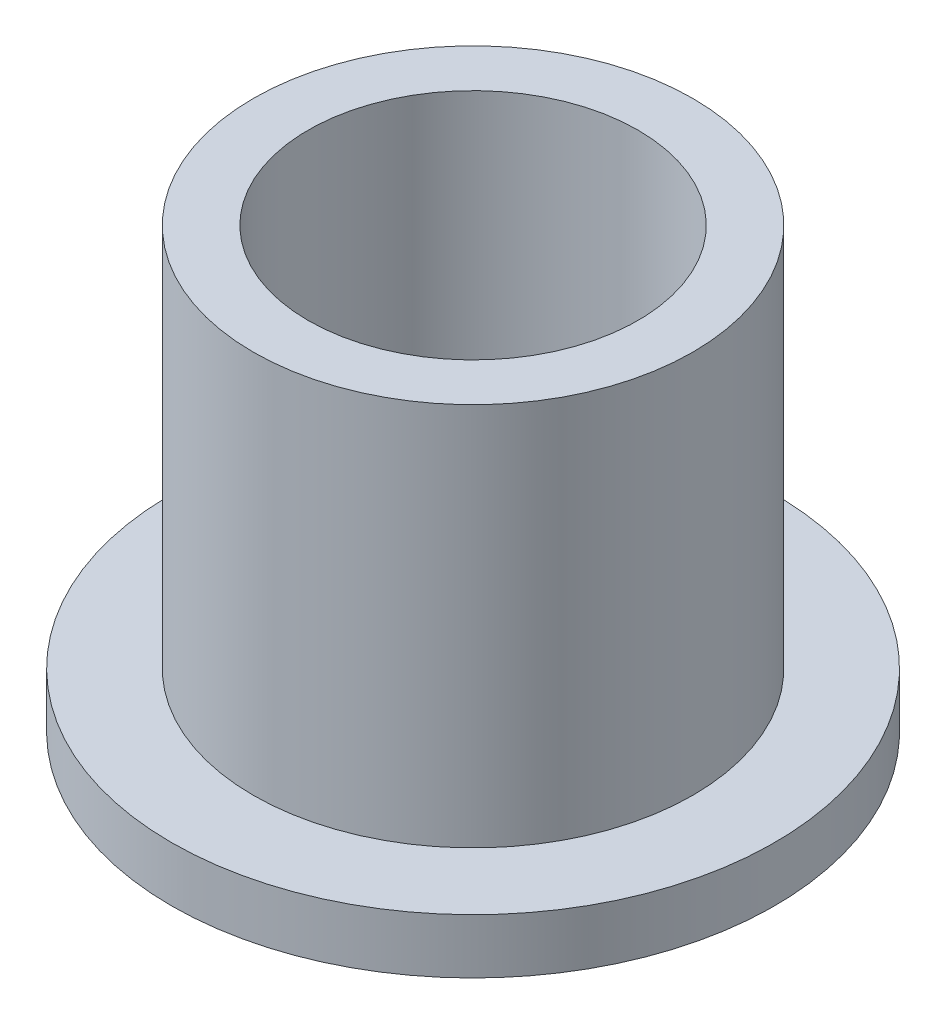
ISO-10303-21;
HEADER;
FILE_DESCRIPTION(('STEP AP214'),'2;1');
FILE_NAME('part.step','',(''),(''),'','','');
FILE_SCHEMA(('AUTOMOTIVE_DESIGN { 1 0 10303 214 1 1 1 1 }'));
ENDSEC;
DATA;
#1=APPLICATION_CONTEXT('core data for automotive mechanical design processes');
#2=APPLICATION_PROTOCOL_DEFINITION('international standard','automotive_design',2000,#1);
#3=PRODUCT_CONTEXT('',#1,'mechanical');
#4=PRODUCT('Part','Part','',(#3));
#5=PRODUCT_RELATED_PRODUCT_CATEGORY('part','',(#4));
#6=PRODUCT_DEFINITION_FORMATION('','',#4);
#7=PRODUCT_DEFINITION_CONTEXT('part definition',#1,'design');
#8=PRODUCT_DEFINITION('design','',#6,#7);
#9=PRODUCT_DEFINITION_SHAPE('','',#8);
#10=(LENGTH_UNIT() NAMED_UNIT(*) SI_UNIT(.MILLI.,.METRE.));
#11=(NAMED_UNIT(*) PLANE_ANGLE_UNIT() SI_UNIT($,.RADIAN.));
#12=(NAMED_UNIT(*) SI_UNIT($,.STERADIAN.) SOLID_ANGLE_UNIT());
#13=UNCERTAINTY_MEASURE_WITH_UNIT(LENGTH_MEASURE(1.E-05),#10,'distance_accuracy_value','');
#14=(GEOMETRIC_REPRESENTATION_CONTEXT(3) GLOBAL_UNCERTAINTY_ASSIGNED_CONTEXT((#13)) GLOBAL_UNIT_ASSIGNED_CONTEXT((#10,
#11,#12)) REPRESENTATION_CONTEXT('',''));
#15=CARTESIAN_POINT('',(0.,0.,0.));
#16=DIRECTION('',(0.,0.,1.));
#17=DIRECTION('',(1.,0.,0.));
#18=AXIS2_PLACEMENT_3D('',#15,#16,#17);
#19=CARTESIAN_POINT('',(0.,12.7,0.));
#20=DIRECTION('',(0.,1.,0.));
#21=DIRECTION('',(0.,0.,1.));
#22=AXIS2_PLACEMENT_3D('',#19,#20,#21);
#23=PLANE('',#22);
#24=CARTESIAN_POINT('',(0.,12.7,0.));
#25=DIRECTION('',(0.,1.,0.));
#26=DIRECTION('',(0.,0.,1.));
#27=AXIS2_PLACEMENT_3D('',#24,#25,#26);
#28=CIRCLE('',#27,6.3627);
#29=CARTESIAN_POINT('',(0.,12.7,6.3627));
#30=VERTEX_POINT('',#29);
#31=EDGE_CURVE('E10',#30,#30,#28,.T.);
#32=ORIENTED_EDGE('',*,*,#31,.T.);
#33=EDGE_LOOP('',(#32));
#34=FACE_BOUND('',#33,.T.);
#35=CARTESIAN_POINT('',(0.,12.7,0.));
#36=DIRECTION('',(0.,1.,0.));
#37=DIRECTION('',(0.,0.,1.));
#38=AXIS2_PLACEMENT_3D('',#35,#36,#37);
#39=CIRCLE('',#38,4.7752);
#40=CARTESIAN_POINT('',(0.,12.7,4.7752));
#41=VERTEX_POINT('',#40);
#42=EDGE_CURVE('E40',#41,#41,#39,.T.);
#43=ORIENTED_EDGE('',*,*,#42,.F.);
#44=EDGE_LOOP('',(#43));
#45=FACE_BOUND('',#44,.T.);
#46=ADVANCED_FACE('F33',(#34,#45),#23,.T.);
#47=CARTESIAN_POINT('',(0.,0.,0.));
#48=DIRECTION('',(0.,1.,0.));
#49=DIRECTION('',(0.,0.,1.));
#50=AXIS2_PLACEMENT_3D('',#47,#48,#49);
#51=PLANE('',#50);
#52=CARTESIAN_POINT('',(0.,0.,0.));
#53=DIRECTION('',(0.,1.,0.));
#54=DIRECTION('',(0.,0.,1.));
#55=AXIS2_PLACEMENT_3D('',#52,#53,#54);
#56=CIRCLE('',#55,4.7752);
#57=CARTESIAN_POINT('',(0.,0.,4.7752));
#58=VERTEX_POINT('',#57);
#59=EDGE_CURVE('E44',#58,#58,#56,.T.);
#60=ORIENTED_EDGE('',*,*,#59,.T.);
#61=EDGE_LOOP('',(#60));
#62=FACE_BOUND('',#61,.T.);
#63=CARTESIAN_POINT('',(0.,0.,0.));
#64=DIRECTION('',(0.,1.,0.));
#65=DIRECTION('',(0.,0.,1.));
#66=AXIS2_PLACEMENT_3D('',#63,#64,#65);
#67=CIRCLE('',#66,8.73125);
#68=CARTESIAN_POINT('',(0.,0.,8.73125));
#69=VERTEX_POINT('',#68);
#70=EDGE_CURVE('E51',#69,#69,#67,.T.);
#71=ORIENTED_EDGE('',*,*,#70,.F.);
#72=EDGE_LOOP('',(#71));
#73=FACE_BOUND('',#72,.T.);
#74=ADVANCED_FACE('F76',(#62,#73),#51,.F.);
#75=CARTESIAN_POINT('',(0.,12.7,0.));
#76=DIRECTION('',(0.,-1.,0.));
#77=DIRECTION('',(0.,0.,-1.));
#78=AXIS2_PLACEMENT_3D('',#75,#76,#77);
#79=CYLINDRICAL_SURFACE('',#78,6.3627);
#80=CARTESIAN_POINT('',(0.,1.5875,0.));
#81=DIRECTION('',(0.,1.,0.));
#82=DIRECTION('',(0.,0.,1.));
#83=AXIS2_PLACEMENT_3D('',#80,#81,#82);
#84=CIRCLE('',#83,6.3627);
#85=CARTESIAN_POINT('',(0.,1.5875,6.3627));
#86=VERTEX_POINT('',#85);
#87=EDGE_CURVE('E54',#86,#86,#84,.T.);
#88=ORIENTED_EDGE('',*,*,#87,.T.);
#89=EDGE_LOOP('',(#88));
#90=FACE_BOUND('',#89,.T.);
#91=ORIENTED_EDGE('',*,*,#31,.F.);
#92=EDGE_LOOP('',(#91));
#93=FACE_BOUND('',#92,.T.);
#94=ADVANCED_FACE('F35',(#90,#93),#79,.T.);
#95=CARTESIAN_POINT('',(0.,12.7,0.));
#96=DIRECTION('',(0.,-1.,0.));
#97=DIRECTION('',(0.,0.,-1.));
#98=AXIS2_PLACEMENT_3D('',#95,#96,#97);
#99=CYLINDRICAL_SURFACE('',#98,4.7752);
#100=ORIENTED_EDGE('',*,*,#42,.T.);
#101=EDGE_LOOP('',(#100));
#102=FACE_BOUND('',#101,.T.);
#103=ORIENTED_EDGE('',*,*,#59,.F.);
#104=EDGE_LOOP('',(#103));
#105=FACE_BOUND('',#104,.T.);
#106=ADVANCED_FACE('F65',(#102,#105),#99,.F.);
#107=CARTESIAN_POINT('',(0.,1.5875,0.));
#108=DIRECTION('',(0.,1.,0.));
#109=DIRECTION('',(0.,0.,1.));
#110=AXIS2_PLACEMENT_3D('',#107,#108,#109);
#111=PLANE('',#110);
#112=CARTESIAN_POINT('',(0.,1.5875,0.));
#113=DIRECTION('',(0.,1.,0.));
#114=DIRECTION('',(0.,0.,1.));
#115=AXIS2_PLACEMENT_3D('',#112,#113,#114);
#116=CIRCLE('',#115,8.73125);
#117=CARTESIAN_POINT('',(0.,1.5875,8.73125));
#118=VERTEX_POINT('',#117);
#119=EDGE_CURVE('E49',#118,#118,#116,.T.);
#120=ORIENTED_EDGE('',*,*,#119,.T.);
#121=EDGE_LOOP('',(#120));
#122=FACE_BOUND('',#121,.T.);
#123=ORIENTED_EDGE('',*,*,#87,.F.);
#124=EDGE_LOOP('',(#123));
#125=FACE_BOUND('',#124,.T.);
#126=ADVANCED_FACE('F62',(#122,#125),#111,.T.);
#127=CARTESIAN_POINT('',(0.,1.5875,0.));
#128=DIRECTION('',(0.,-1.,0.));
#129=DIRECTION('',(0.,0.,-1.));
#130=AXIS2_PLACEMENT_3D('',#127,#128,#129);
#131=CYLINDRICAL_SURFACE('',#130,8.73125);
#132=ORIENTED_EDGE('',*,*,#119,.F.);
#133=EDGE_LOOP('',(#132));
#134=FACE_BOUND('',#133,.T.);
#135=ORIENTED_EDGE('',*,*,#70,.T.);
#136=EDGE_LOOP('',(#135));
#137=FACE_BOUND('',#136,.T.);
#138=ADVANCED_FACE('F64',(#134,#137),#131,.T.);
#139=CLOSED_SHELL('',(#46,#74,#94,#106,#126,#138));
#140=MANIFOLD_SOLID_BREP('B2',#139);
#141=ADVANCED_BREP_SHAPE_REPRESENTATION('',(#18,#140),#14);
#142=SHAPE_DEFINITION_REPRESENTATION(#9,#141);
ENDSEC;
END-ISO-10303-21;
